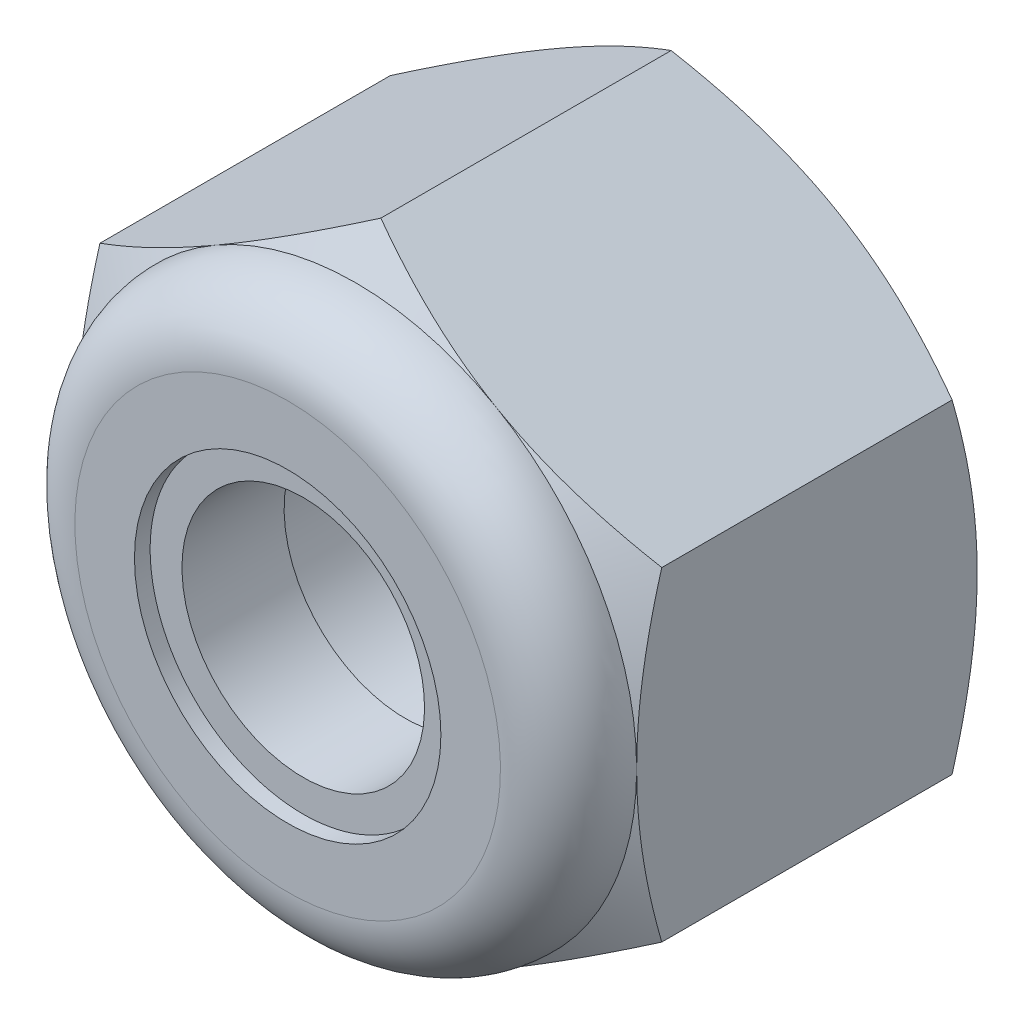
ISO-10303-21;
HEADER;
FILE_DESCRIPTION(('STEP AP214'),'2;1');
FILE_NAME('part.step','',(''),(''),'','','');
FILE_SCHEMA(('AUTOMOTIVE_DESIGN { 1 0 10303 214 1 1 1 1 }'));
ENDSEC;
DATA;
#1=APPLICATION_CONTEXT('core data for automotive mechanical design processes');
#2=APPLICATION_PROTOCOL_DEFINITION('international standard','automotive_design',2000,#1);
#3=PRODUCT_CONTEXT('',#1,'mechanical');
#4=PRODUCT('Part','Part','',(#3));
#5=PRODUCT_RELATED_PRODUCT_CATEGORY('part','',(#4));
#6=PRODUCT_DEFINITION_FORMATION('','',#4);
#7=PRODUCT_DEFINITION_CONTEXT('part definition',#1,'design');
#8=PRODUCT_DEFINITION('design','',#6,#7);
#9=PRODUCT_DEFINITION_SHAPE('','',#8);
#10=(LENGTH_UNIT() NAMED_UNIT(*) SI_UNIT(.MILLI.,.METRE.));
#11=(NAMED_UNIT(*) PLANE_ANGLE_UNIT() SI_UNIT($,.RADIAN.));
#12=(NAMED_UNIT(*) SI_UNIT($,.STERADIAN.) SOLID_ANGLE_UNIT());
#13=UNCERTAINTY_MEASURE_WITH_UNIT(LENGTH_MEASURE(1.E-05),#10,'distance_accuracy_value','');
#14=(GEOMETRIC_REPRESENTATION_CONTEXT(3) GLOBAL_UNCERTAINTY_ASSIGNED_CONTEXT((#13)) GLOBAL_UNIT_ASSIGNED_CONTEXT((#10,
#11,#12)) REPRESENTATION_CONTEXT('',''));
#15=CARTESIAN_POINT('',(0.,0.,0.));
#16=DIRECTION('',(0.,0.,1.));
#17=DIRECTION('',(1.,0.,0.));
#18=AXIS2_PLACEMENT_3D('',#15,#16,#17);
#19=CARTESIAN_POINT('',(0.,0.,3.8476));
#20=DIRECTION('',(0.,0.,1.));
#21=DIRECTION('',(0.,-1.,0.));
#22=AXIS2_PLACEMENT_3D('',#19,#20,#21);
#23=PLANE('',#22);
#24=CARTESIAN_POINT('',(0.,0.,3.8476));
#25=DIRECTION('',(0.,0.,1.));
#26=DIRECTION('',(0.,-1.,0.));
#27=AXIS2_PLACEMENT_3D('',#24,#25,#26);
#28=CIRCLE('',#27,1.1875);
#29=CARTESIAN_POINT('',(0.,1.1875,3.8476));
#30=VERTEX_POINT('',#29);
#31=EDGE_CURVE('P0_E49',#30,#30,#28,.T.);
#32=ORIENTED_EDGE('',*,*,#31,.F.);
#33=EDGE_LOOP('',(#32));
#34=FACE_BOUND('',#33,.T.);
#35=CARTESIAN_POINT('',(0.,0.,3.8476));
#36=DIRECTION('',(0.,0.,1.));
#37=DIRECTION('',(0.,-1.,0.));
#38=AXIS2_PLACEMENT_3D('',#35,#36,#37);
#39=CIRCLE('',#38,1.5);
#40=CARTESIAN_POINT('',(0.,1.5,3.8476));
#41=VERTEX_POINT('',#40);
#42=EDGE_CURVE('P0_E68',#41,#41,#39,.T.);
#43=ORIENTED_EDGE('',*,*,#42,.T.);
#44=EDGE_LOOP('',(#43));
#45=FACE_BOUND('',#44,.T.);
#46=ADVANCED_FACE('P0_F17',(#34,#45),#23,.T.);
#47=CARTESIAN_POINT('',(0.,0.,2.8476));
#48=DIRECTION('',(0.,0.,1.));
#49=DIRECTION('',(0.,-1.,0.));
#50=AXIS2_PLACEMENT_3D('',#47,#48,#49);
#51=PLANE('',#50);
#52=CARTESIAN_POINT('',(0.,0.,2.8476));
#53=DIRECTION('',(0.,0.,1.));
#54=DIRECTION('',(0.,-1.,0.));
#55=AXIS2_PLACEMENT_3D('',#52,#53,#54);
#56=CIRCLE('',#55,1.1875);
#57=CARTESIAN_POINT('',(0.,1.1875,2.8476));
#58=VERTEX_POINT('',#57);
#59=EDGE_CURVE('P0_E56',#58,#58,#56,.T.);
#60=ORIENTED_EDGE('',*,*,#59,.T.);
#61=EDGE_LOOP('',(#60));
#62=FACE_BOUND('',#61,.T.);
#63=CARTESIAN_POINT('',(0.,0.,2.8476));
#64=DIRECTION('',(0.,0.,1.));
#65=DIRECTION('',(0.,-1.,0.));
#66=AXIS2_PLACEMENT_3D('',#63,#64,#65);
#67=CIRCLE('',#66,1.5);
#68=CARTESIAN_POINT('',(0.,1.5,2.8476));
#69=VERTEX_POINT('',#68);
#70=EDGE_CURVE('P0_E11',#69,#69,#67,.T.);
#71=ORIENTED_EDGE('',*,*,#70,.F.);
#72=EDGE_LOOP('',(#71));
#73=FACE_BOUND('',#72,.T.);
#74=ADVANCED_FACE('P0_F60',(#62,#73),#51,.F.);
#75=CARTESIAN_POINT('',(0.,0.,2.8476));
#76=DIRECTION('',(0.,0.,1.));
#77=DIRECTION('',(0.,-1.,0.));
#78=AXIS2_PLACEMENT_3D('',#75,#76,#77);
#79=CYLINDRICAL_SURFACE('',#78,1.5);
#80=ORIENTED_EDGE('',*,*,#42,.F.);
#81=DIRECTION('',(0.,0.,-1.));
#82=VECTOR('',#81,1.);
#83=CARTESIAN_POINT('',(0.,1.5,2.8476));
#84=LINE('',#83,#82);
#85=EDGE_CURVE('P0_E21',#41,#69,#84,.T.);
#86=ORIENTED_EDGE('',*,*,#85,.T.);
#87=ORIENTED_EDGE('',*,*,#70,.T.);
#88=ORIENTED_EDGE('',*,*,#85,.F.);
#89=EDGE_LOOP('',(#80,#86,#87,#88));
#90=FACE_BOUND('',#89,.T.);
#91=ADVANCED_FACE('P0_F19',(#90),#79,.T.);
#92=CARTESIAN_POINT('',(0.,0.,2.8476));
#93=DIRECTION('',(0.,0.,1.));
#94=DIRECTION('',(0.,-1.,0.));
#95=AXIS2_PLACEMENT_3D('',#92,#93,#94);
#96=CYLINDRICAL_SURFACE('',#95,1.1875);
#97=ORIENTED_EDGE('',*,*,#59,.F.);
#98=DIRECTION('',(0.,0.,1.));
#99=VECTOR('',#98,1.);
#100=CARTESIAN_POINT('',(0.,1.1875,2.8476));
#101=LINE('',#100,#99);
#102=EDGE_CURVE('P0_E53',#58,#30,#101,.T.);
#103=ORIENTED_EDGE('',*,*,#102,.T.);
#104=ORIENTED_EDGE('',*,*,#31,.T.);
#105=ORIENTED_EDGE('',*,*,#102,.F.);
#106=EDGE_LOOP('',(#97,#103,#104,#105));
#107=FACE_BOUND('',#106,.T.);
#108=ADVANCED_FACE('P0_F55',(#107),#96,.F.);
#109=CLOSED_SHELL('',(#46,#74,#91,#108));
#110=MANIFOLD_SOLID_BREP('P0_B1',#109);
#111=CARTESIAN_POINT('',(0.,0.,0.));
#112=DIRECTION('',(0.,0.,1.));
#113=DIRECTION('',(0.,1.,0.));
#114=AXIS2_PLACEMENT_3D('',#111,#112,#113);
#115=CONICAL_SURFACE('',#114,2.75,1.0471975511966);
#116=CARTESIAN_POINT('',(1.375,2.38156986040721,0.));
#117=CARTESIAN_POINT('',(2.01313972079903,2.01313972082329,0.));
#118=CARTESIAN_POINT('',(2.74999999996174,1.58771324029356,0.245620093049108));
#119=(BOUNDED_CURVE() B_SPLINE_CURVE(2,(#116,#117,#118),.UNSPECIFIED.,.F.,
.F.) B_SPLINE_CURVE_WITH_KNOTS((3,3),(1.07884964363979,1.45937748055777),
.UNSPECIFIED.) CURVE() GEOMETRIC_REPRESENTATION_ITEM() RATIONAL_B_SPLINE_CURVE((2.36464609081185,
2.36464609081185,2.1948721399581)) REPRESENTATION_ITEM(''));
#120=CARTESIAN_POINT('',(1.375,2.38156986040721,0.));
#121=VERTEX_POINT('',#120);
#122=CARTESIAN_POINT('',(2.75,1.58771324027174,0.245620093061687));
#123=VERTEX_POINT('',#122);
#124=EDGE_CURVE('P1_E198',#121,#123,#119,.T.);
#125=ORIENTED_EDGE('',*,*,#124,.T.);
#126=CARTESIAN_POINT('',(2.75,1.58771324027167,0.245620093061918));
#127=CARTESIAN_POINT('',(2.75,0.736860279185669,0.));
#128=CARTESIAN_POINT('',(2.75,0.,0.));
#129=(BOUNDED_CURVE() B_SPLINE_CURVE(2,(#126,#127,#128),.UNSPECIFIED.,.F.,
.F.) B_SPLINE_CURVE_WITH_KNOTS((3,3),(0.698321806712598,1.07884964363979),
.UNSPECIFIED.) CURVE() GEOMETRIC_REPRESENTATION_ITEM() RATIONAL_B_SPLINE_CURVE((2.19487213994988,
2.36464609081185,2.36464609081185)) REPRESENTATION_ITEM(''));
#130=CARTESIAN_POINT('',(2.75,0.,0.));
#131=VERTEX_POINT('',#130);
#132=EDGE_CURVE('P1_E144',#123,#131,#129,.T.);
#133=ORIENTED_EDGE('',*,*,#132,.T.);
#134=CARTESIAN_POINT('',(0.,0.,0.));
#135=DIRECTION('',(0.,0.,-1.));
#136=DIRECTION('',(0.,1.,0.));
#137=AXIS2_PLACEMENT_3D('',#134,#135,#136);
#138=CIRCLE('',#137,2.75);
#139=EDGE_CURVE('P1_E206',#121,#131,#138,.T.);
#140=ORIENTED_EDGE('',*,*,#139,.F.);
#141=EDGE_LOOP('',(#125,#133,#140));
#142=FACE_BOUND('',#141,.T.);
#143=ADVANCED_FACE('P1_F17',(#142),#115,.T.);
#144=CARTESIAN_POINT('',(0.,0.,0.));
#145=DIRECTION('',(0.,0.,1.));
#146=DIRECTION('',(0.,1.,0.));
#147=AXIS2_PLACEMENT_3D('',#144,#145,#146);
#148=CONICAL_SURFACE('',#147,2.75,1.0471975511966);
#149=CARTESIAN_POINT('',(2.75,-1.58771324027147,0.24562009306186));
#150=CARTESIAN_POINT('',(2.01313972081441,-2.01313972081441,0.));
#151=CARTESIAN_POINT('',(1.375,-2.38156986040721,0.));
#152=(BOUNDED_CURVE() B_SPLINE_CURVE(2,(#149,#150,#151),.UNSPECIFIED.,.F.,
.F.) B_SPLINE_CURVE_WITH_KNOTS((3,3),(0.69832180671264,1.07884964363979),
.UNSPECIFIED.) CURVE() GEOMETRIC_REPRESENTATION_ITEM() RATIONAL_B_SPLINE_CURVE((2.19487213994992,
2.36464609081185,2.36464609081185)) REPRESENTATION_ITEM(''));
#153=CARTESIAN_POINT('',(2.75,-1.58771324027147,0.245620093061859));
#154=VERTEX_POINT('',#153);
#155=CARTESIAN_POINT('',(1.375,-2.38156986040721,0.));
#156=VERTEX_POINT('',#155);
#157=EDGE_CURVE('P1_E306',#154,#156,#152,.T.);
#158=ORIENTED_EDGE('',*,*,#157,.T.);
#159=CARTESIAN_POINT('',(0.,0.,0.));
#160=DIRECTION('',(0.,0.,-1.));
#161=DIRECTION('',(0.,1.,0.));
#162=AXIS2_PLACEMENT_3D('',#159,#160,#161);
#163=CIRCLE('',#162,2.75);
#164=EDGE_CURVE('P1_E213',#131,#156,#163,.T.);
#165=ORIENTED_EDGE('',*,*,#164,.F.);
#166=CARTESIAN_POINT('',(2.75,0.,0.));
#167=CARTESIAN_POINT('',(2.75,-0.736860279167901,0.));
#168=CARTESIAN_POINT('',(2.75,-1.58771324022746,0.245620093049155));
#169=(BOUNDED_CURVE() B_SPLINE_CURVE(2,(#166,#167,#168),.UNSPECIFIED.,.F.,
.F.) B_SPLINE_CURVE_WITH_KNOTS((3,3),(1.07884964363979,1.45937748055781),
.UNSPECIFIED.) CURVE() GEOMETRIC_REPRESENTATION_ITEM() RATIONAL_B_SPLINE_CURVE((2.36464609081185,
2.36464609081185,2.19487213995807)) REPRESENTATION_ITEM(''));
#170=EDGE_CURVE('P1_E11',#131,#154,#169,.T.);
#171=ORIENTED_EDGE('',*,*,#170,.T.);
#172=EDGE_LOOP('',(#158,#165,#171));
#173=FACE_BOUND('',#172,.T.);
#174=ADVANCED_FACE('P1_F695',(#173),#148,.T.);
#175=CARTESIAN_POINT('',(0.,0.,0.));
#176=DIRECTION('',(0.,0.,1.));
#177=DIRECTION('',(0.,-1.,0.));
#178=AXIS2_PLACEMENT_3D('',#175,#176,#177);
#179=CONICAL_SURFACE('',#178,2.75,1.0471975511966);
#180=CARTESIAN_POINT('',(0.,-3.17542648054294,0.24562009306186));
#181=CARTESIAN_POINT('',(-0.736860279185588,-2.75,0.));
#182=CARTESIAN_POINT('',(-1.375,-2.3815698604072,0.));
#183=(BOUNDED_CURVE() B_SPLINE_CURVE(2,(#180,#181,#182),.UNSPECIFIED.,.F.,
.F.) B_SPLINE_CURVE_WITH_KNOTS((3,3),(0.698321806712639,1.07884964363979),
.UNSPECIFIED.) CURVE() GEOMETRIC_REPRESENTATION_ITEM() RATIONAL_B_SPLINE_CURVE((2.19487213994992,
2.36464609081185,2.36464609081185)) REPRESENTATION_ITEM(''));
#184=CARTESIAN_POINT('',(0.,-3.17542648054294,0.245620093061859));
#185=VERTEX_POINT('',#184);
#186=CARTESIAN_POINT('',(-1.375,-2.38156986040721,0.));
#187=VERTEX_POINT('',#186);
#188=EDGE_CURVE('P1_E135',#185,#187,#183,.T.);
#189=ORIENTED_EDGE('',*,*,#188,.T.);
#190=CARTESIAN_POINT('',(0.,0.,0.));
#191=DIRECTION('',(0.,0.,-1.));
#192=DIRECTION('',(0.,1.,0.));
#193=AXIS2_PLACEMENT_3D('',#190,#191,#192);
#194=CIRCLE('',#193,2.75);
#195=EDGE_CURVE('P1_E138',#156,#187,#194,.T.);
#196=ORIENTED_EDGE('',*,*,#195,.F.);
#197=CARTESIAN_POINT('',(1.375,-2.38156986040721,0.));
#198=CARTESIAN_POINT('',(0.736860279200904,-2.74999999999116,0.));
#199=CARTESIAN_POINT('',(3.81079064727698E-11,-3.17542648052094,0.245620093049158));
#200=(BOUNDED_CURVE() B_SPLINE_CURVE(2,(#197,#198,#199),.UNSPECIFIED.,.F.,
.F.) B_SPLINE_CURVE_WITH_KNOTS((3,3),(1.07884964363979,1.45937748055781),
.UNSPECIFIED.) CURVE() GEOMETRIC_REPRESENTATION_ITEM() RATIONAL_B_SPLINE_CURVE((2.36464609081185,
2.36464609081185,2.19487213995807)) REPRESENTATION_ITEM(''));
#201=EDGE_CURVE('P1_E130',#156,#185,#200,.T.);
#202=ORIENTED_EDGE('',*,*,#201,.T.);
#203=EDGE_LOOP('',(#189,#196,#202));
#204=FACE_BOUND('',#203,.T.);
#205=ADVANCED_FACE('P1_F132',(#204),#179,.T.);
#206=CARTESIAN_POINT('',(0.,0.,0.));
#207=DIRECTION('',(0.,0.,1.));
#208=DIRECTION('',(0.,1.,0.));
#209=AXIS2_PLACEMENT_3D('',#206,#207,#208);
#210=CONICAL_SURFACE('',#209,2.75,1.0471975511966);
#211=CARTESIAN_POINT('',(-2.75,-1.58771324027147,0.24562009306186));
#212=CARTESIAN_POINT('',(-2.75,-0.736860279185586,0.));
#213=CARTESIAN_POINT('',(-2.75,0.,0.));
#214=(BOUNDED_CURVE() B_SPLINE_CURVE(2,(#211,#212,#213),.UNSPECIFIED.,.F.,
.F.) B_SPLINE_CURVE_WITH_KNOTS((3,3),(0.69832180671264,1.07884964363979),
.UNSPECIFIED.) CURVE() GEOMETRIC_REPRESENTATION_ITEM() RATIONAL_B_SPLINE_CURVE((2.19487213994992,
2.36464609081185,2.36464609081185)) REPRESENTATION_ITEM(''));
#215=CARTESIAN_POINT('',(-2.75,-1.58771324027147,0.24562009306186));
#216=VERTEX_POINT('',#215);
#217=CARTESIAN_POINT('',(-2.75,0.,0.));
#218=VERTEX_POINT('',#217);
#219=EDGE_CURVE('P1_E187',#216,#218,#214,.T.);
#220=ORIENTED_EDGE('',*,*,#219,.T.);
#221=CARTESIAN_POINT('',(0.,0.,0.));
#222=DIRECTION('',(0.,0.,-1.));
#223=DIRECTION('',(0.,1.,0.));
#224=AXIS2_PLACEMENT_3D('',#221,#222,#223);
#225=CIRCLE('',#224,2.75);
#226=EDGE_CURVE('P1_E222',#187,#218,#225,.T.);
#227=ORIENTED_EDGE('',*,*,#226,.F.);
#228=CARTESIAN_POINT('',(-1.375,-2.38156986040721,0.));
#229=CARTESIAN_POINT('',(-2.0131397207991,-2.01313972082326,0.));
#230=CARTESIAN_POINT('',(-2.74999999996189,-1.58771324029347,0.245620093049157));
#231=(BOUNDED_CURVE() B_SPLINE_CURVE(2,(#228,#229,#230),.UNSPECIFIED.,.F.,
.F.) B_SPLINE_CURVE_WITH_KNOTS((3,3),(1.07884964363979,1.45937748055781),
.UNSPECIFIED.) CURVE() GEOMETRIC_REPRESENTATION_ITEM() RATIONAL_B_SPLINE_CURVE((2.36464609081185,
2.36464609081185,2.19487213995807)) REPRESENTATION_ITEM(''));
#232=EDGE_CURVE('P1_E163',#187,#216,#231,.T.);
#233=ORIENTED_EDGE('',*,*,#232,.T.);
#234=EDGE_LOOP('',(#220,#227,#233));
#235=FACE_BOUND('',#234,.T.);
#236=ADVANCED_FACE('P1_F704',(#235),#210,.T.);
#237=CARTESIAN_POINT('',(0.,0.,0.));
#238=DIRECTION('',(0.,0.,1.));
#239=DIRECTION('',(0.,1.,0.));
#240=AXIS2_PLACEMENT_3D('',#237,#238,#239);
#241=CONICAL_SURFACE('',#240,2.75,1.0471975511966);
#242=CARTESIAN_POINT('',(-2.75,0.,0.));
#243=CARTESIAN_POINT('',(-2.75,0.736860279167905,0.));
#244=CARTESIAN_POINT('',(-2.75,1.58771324022747,0.245620093049161));
#245=(BOUNDED_CURVE() B_SPLINE_CURVE(2,(#242,#243,#244),.UNSPECIFIED.,.F.,
.F.) B_SPLINE_CURVE_WITH_KNOTS((3,3),(1.07884964363979,1.45937748055781),
.UNSPECIFIED.) CURVE() GEOMETRIC_REPRESENTATION_ITEM() RATIONAL_B_SPLINE_CURVE((2.36464609081185,
2.36464609081185,2.19487213995806)) REPRESENTATION_ITEM(''));
#246=CARTESIAN_POINT('',(-2.75,1.58771324027147,0.245620093061863));
#247=VERTEX_POINT('',#246);
#248=EDGE_CURVE('P1_E165',#218,#247,#245,.T.);
#249=ORIENTED_EDGE('',*,*,#248,.T.);
#250=CARTESIAN_POINT('',(-2.75,1.58771324027147,0.245620093061863));
#251=CARTESIAN_POINT('',(-2.01313972081441,2.01313972081441,0.));
#252=CARTESIAN_POINT('',(-1.375,2.38156986040721,0.));
#253=(BOUNDED_CURVE() B_SPLINE_CURVE(2,(#250,#251,#252),.UNSPECIFIED.,.F.,
.F.) B_SPLINE_CURVE_WITH_KNOTS((3,3),(0.69832180671264,1.07884964363979),
.UNSPECIFIED.) CURVE() GEOMETRIC_REPRESENTATION_ITEM() RATIONAL_B_SPLINE_CURVE((2.19487213994991,
2.36464609081185,2.36464609081185)) REPRESENTATION_ITEM(''));
#254=CARTESIAN_POINT('',(-1.375,2.38156986040721,0.));
#255=VERTEX_POINT('',#254);
#256=EDGE_CURVE('P1_E204',#247,#255,#253,.T.);
#257=ORIENTED_EDGE('',*,*,#256,.T.);
#258=CARTESIAN_POINT('',(0.,0.,0.));
#259=DIRECTION('',(0.,0.,-1.));
#260=DIRECTION('',(0.,1.,0.));
#261=AXIS2_PLACEMENT_3D('',#258,#259,#260);
#262=CIRCLE('',#261,2.75);
#263=EDGE_CURVE('P1_E476',#218,#255,#262,.T.);
#264=ORIENTED_EDGE('',*,*,#263,.F.);
#265=EDGE_LOOP('',(#249,#257,#264));
#266=FACE_BOUND('',#265,.T.);
#267=ADVANCED_FACE('P1_F674',(#266),#241,.T.);
#268=CARTESIAN_POINT('',(0.,0.,3.33333333333333));
#269=DIRECTION('',(0.,0.,-1.));
#270=DIRECTION('',(0.,-1.,0.));
#271=AXIS2_PLACEMENT_3D('',#268,#269,#270);
#272=CONICAL_SURFACE('',#271,2.75,1.0471975511966);
#273=CARTESIAN_POINT('',(-1.375,2.38156986040721,3.33333333333333));
#274=CARTESIAN_POINT('',(-2.01313972079904,2.01313972082329,3.33333333333333));
#275=CARTESIAN_POINT('',(-2.74999999996175,1.58771324029356,3.08771324028422));
#276=(BOUNDED_CURVE() B_SPLINE_CURVE(2,(#273,#274,#275),.UNSPECIFIED.,.F.,
.F.) B_SPLINE_CURVE_WITH_KNOTS((3,3),(1.07884964363979,1.45937748055777),
.UNSPECIFIED.) CURVE() GEOMETRIC_REPRESENTATION_ITEM() RATIONAL_B_SPLINE_CURVE((2.36464609081185,
2.36464609081185,2.19487213995809)) REPRESENTATION_ITEM(''));
#277=CARTESIAN_POINT('',(-1.375,2.38156986040721,3.33333333333333));
#278=VERTEX_POINT('',#277);
#279=CARTESIAN_POINT('',(-2.75,1.58771324027174,3.08771324027165));
#280=VERTEX_POINT('',#279);
#281=EDGE_CURVE('P1_E188',#278,#280,#276,.T.);
#282=ORIENTED_EDGE('',*,*,#281,.T.);
#283=CARTESIAN_POINT('',(-2.75,1.58771324027167,3.08771324027142));
#284=CARTESIAN_POINT('',(-2.75,0.736860279185665,3.33333333333333));
#285=CARTESIAN_POINT('',(-2.75,0.,3.33333333333333));
#286=(BOUNDED_CURVE() B_SPLINE_CURVE(2,(#283,#284,#285),.UNSPECIFIED.,.F.,
.F.) B_SPLINE_CURVE_WITH_KNOTS((3,3),(0.698321806712598,1.07884964363979),
.UNSPECIFIED.) CURVE() GEOMETRIC_REPRESENTATION_ITEM() RATIONAL_B_SPLINE_CURVE((2.19487213994988,
2.36464609081185,2.36464609081185)) REPRESENTATION_ITEM(''));
#287=CARTESIAN_POINT('',(-2.75,0.,3.33333333333333));
#288=VERTEX_POINT('',#287);
#289=EDGE_CURVE('P1_E172',#280,#288,#286,.T.);
#290=ORIENTED_EDGE('',*,*,#289,.T.);
#291=CARTESIAN_POINT('',(0.,0.,3.33333333333333));
#292=DIRECTION('',(0.,0.,1.));
#293=DIRECTION('',(0.,-1.,0.));
#294=AXIS2_PLACEMENT_3D('',#291,#292,#293);
#295=CIRCLE('',#294,2.75);
#296=EDGE_CURVE('P1_E239',#278,#288,#295,.T.);
#297=ORIENTED_EDGE('',*,*,#296,.F.);
#298=EDGE_LOOP('',(#282,#290,#297));
#299=FACE_BOUND('',#298,.T.);
#300=ADVANCED_FACE('P1_F19',(#299),#272,.T.);
#301=CARTESIAN_POINT('',(0.,0.,3.33333333333333));
#302=DIRECTION('',(0.,0.,-1.));
#303=DIRECTION('',(0.,-1.,0.));
#304=AXIS2_PLACEMENT_3D('',#301,#302,#303);
#305=CONICAL_SURFACE('',#304,2.75,1.0471975511966);
#306=CARTESIAN_POINT('',(-2.75,0.,3.33333333333333));
#307=CARTESIAN_POINT('',(-2.75,-0.736860279167899,3.33333333333333));
#308=CARTESIAN_POINT('',(-2.75,-1.58771324022745,3.08771324028418));
#309=(BOUNDED_CURVE() B_SPLINE_CURVE(2,(#306,#307,#308),.UNSPECIFIED.,.F.,
.F.) B_SPLINE_CURVE_WITH_KNOTS((3,3),(1.07884964363979,1.4593774805578),
.UNSPECIFIED.) CURVE() GEOMETRIC_REPRESENTATION_ITEM() RATIONAL_B_SPLINE_CURVE((2.36464609081185,
2.36464609081185,2.19487213995807)) REPRESENTATION_ITEM(''));
#310=CARTESIAN_POINT('',(-2.75,-1.58771324027147,3.08771324027147));
#311=VERTEX_POINT('',#310);
#312=EDGE_CURVE('P1_E370',#288,#311,#309,.T.);
#313=ORIENTED_EDGE('',*,*,#312,.T.);
#314=CARTESIAN_POINT('',(-2.75,-1.58771324027147,3.08771324027148));
#315=CARTESIAN_POINT('',(-2.01313972081441,-2.01313972081441,3.33333333333334));
#316=CARTESIAN_POINT('',(-1.37499999999999,-2.38156986040721,3.33333333333334));
#317=(BOUNDED_CURVE() B_SPLINE_CURVE(2,(#314,#315,#316),.UNSPECIFIED.,.F.,
.F.) B_SPLINE_CURVE_WITH_KNOTS((3,3),(0.69832180671264,1.07884964363979),
.UNSPECIFIED.) CURVE() GEOMETRIC_REPRESENTATION_ITEM() RATIONAL_B_SPLINE_CURVE((2.19487213994992,
2.36464609081185,2.36464609081185)) REPRESENTATION_ITEM(''));
#318=CARTESIAN_POINT('',(-1.375,-2.38156986040721,3.33333333333333));
#319=VERTEX_POINT('',#318);
#320=EDGE_CURVE('P1_E157',#311,#319,#317,.T.);
#321=ORIENTED_EDGE('',*,*,#320,.T.);
#322=CARTESIAN_POINT('',(0.,0.,3.33333333333333));
#323=DIRECTION('',(0.,0.,1.));
#324=DIRECTION('',(0.,-1.,0.));
#325=AXIS2_PLACEMENT_3D('',#322,#323,#324);
#326=CIRCLE('',#325,2.75);
#327=EDGE_CURVE('P1_E349',#288,#319,#326,.T.);
#328=ORIENTED_EDGE('',*,*,#327,.F.);
#329=EDGE_LOOP('',(#313,#321,#328));
#330=FACE_BOUND('',#329,.T.);
#331=ADVANCED_FACE('P1_F680',(#330),#305,.T.);
#332=CARTESIAN_POINT('',(0.,0.,3.33333333333333));
#333=DIRECTION('',(0.,0.,-1.));
#334=DIRECTION('',(0.,-1.,0.));
#335=AXIS2_PLACEMENT_3D('',#332,#333,#334);
#336=CONICAL_SURFACE('',#335,2.75,1.0471975511966);
#337=CARTESIAN_POINT('',(1.375,-2.38156986040721,3.33333333333333));
#338=CARTESIAN_POINT('',(2.0131397207991,-2.01313972082326,3.33333333333333));
#339=CARTESIAN_POINT('',(2.74999999996189,-1.58771324029347,3.08771324028418));
#340=(BOUNDED_CURVE() B_SPLINE_CURVE(2,(#337,#338,#339),.UNSPECIFIED.,.F.,
.F.) B_SPLINE_CURVE_WITH_KNOTS((3,3),(1.07884964363979,1.45937748055781),
.UNSPECIFIED.) CURVE() GEOMETRIC_REPRESENTATION_ITEM() RATIONAL_B_SPLINE_CURVE((2.36464609081185,
2.36464609081185,2.19487213995806)) REPRESENTATION_ITEM(''));
#341=CARTESIAN_POINT('',(1.375,-2.38156986040721,3.33333333333333));
#342=VERTEX_POINT('',#341);
#343=CARTESIAN_POINT('',(2.75,-1.58771324027147,3.08771324027147));
#344=VERTEX_POINT('',#343);
#345=EDGE_CURVE('P1_E145',#342,#344,#340,.T.);
#346=ORIENTED_EDGE('',*,*,#345,.T.);
#347=CARTESIAN_POINT('',(2.75,-1.58771324027147,3.08771324027147));
#348=CARTESIAN_POINT('',(2.75,-0.736860279185586,3.33333333333334));
#349=CARTESIAN_POINT('',(2.75,0.,3.33333333333334));
#350=(BOUNDED_CURVE() B_SPLINE_CURVE(2,(#347,#348,#349),.UNSPECIFIED.,.F.,
.F.) B_SPLINE_CURVE_WITH_KNOTS((3,3),(0.69832180671264,1.07884964363979),
.UNSPECIFIED.) CURVE() GEOMETRIC_REPRESENTATION_ITEM() RATIONAL_B_SPLINE_CURVE((2.19487213994992,
2.36464609081185,2.36464609081185)) REPRESENTATION_ITEM(''));
#351=CARTESIAN_POINT('',(2.75,0.,3.33333333333333));
#352=VERTEX_POINT('',#351);
#353=EDGE_CURVE('P1_E29',#344,#352,#350,.T.);
#354=ORIENTED_EDGE('',*,*,#353,.T.);
#355=CARTESIAN_POINT('',(0.,0.,3.33333333333333));
#356=DIRECTION('',(0.,0.,1.));
#357=DIRECTION('',(0.,-1.,0.));
#358=AXIS2_PLACEMENT_3D('',#355,#356,#357);
#359=CIRCLE('',#358,2.75);
#360=EDGE_CURVE('P1_E343',#342,#352,#359,.T.);
#361=ORIENTED_EDGE('',*,*,#360,.F.);
#362=EDGE_LOOP('',(#346,#354,#361));
#363=FACE_BOUND('',#362,.T.);
#364=ADVANCED_FACE('P1_F706',(#363),#336,.T.);
#365=CARTESIAN_POINT('',(0.,0.,3.33333333333333));
#366=DIRECTION('',(0.,0.,-1.));
#367=DIRECTION('',(0.,-1.,0.));
#368=AXIS2_PLACEMENT_3D('',#365,#366,#367);
#369=CONICAL_SURFACE('',#368,2.75,1.0471975511966);
#370=CARTESIAN_POINT('',(2.74999999999985,1.58771324027156,3.08771324027152));
#371=CARTESIAN_POINT('',(2.01313972081435,2.01313972081445,3.33333333333333));
#372=CARTESIAN_POINT('',(1.375,2.38156986040721,3.33333333333333));
#373=(BOUNDED_CURVE() B_SPLINE_CURVE(2,(#370,#371,#372),.UNSPECIFIED.,.F.,
.F.) B_SPLINE_CURVE_WITH_KNOTS((3,3),(0.698321806712675,1.07884964363979),
.UNSPECIFIED.) CURVE() GEOMETRIC_REPRESENTATION_ITEM() RATIONAL_B_SPLINE_CURVE((2.19487213994994,
2.36464609081185,2.36464609081185)) REPRESENTATION_ITEM(''));
#374=CARTESIAN_POINT('',(2.75,1.58771324027174,3.08771324027165));
#375=VERTEX_POINT('',#374);
#376=CARTESIAN_POINT('',(1.375,2.38156986040721,3.33333333333333));
#377=VERTEX_POINT('',#376);
#378=EDGE_CURVE('P1_E108',#375,#377,#373,.T.);
#379=ORIENTED_EDGE('',*,*,#378,.T.);
#380=CARTESIAN_POINT('',(0.,0.,3.33333333333333));
#381=DIRECTION('',(0.,0.,1.));
#382=DIRECTION('',(0.,-1.,0.));
#383=AXIS2_PLACEMENT_3D('',#380,#381,#382);
#384=CIRCLE('',#383,2.75);
#385=EDGE_CURVE('P1_E348',#352,#377,#384,.T.);
#386=ORIENTED_EDGE('',*,*,#385,.F.);
#387=CARTESIAN_POINT('',(2.75,0.,3.33333333333334));
#388=CARTESIAN_POINT('',(2.75,0.736860279167983,3.33333333333333));
#389=CARTESIAN_POINT('',(2.75,1.58771324022767,3.08771324028412));
#390=(BOUNDED_CURVE() B_SPLINE_CURVE(2,(#387,#388,#389),.UNSPECIFIED.,.F.,
.F.) B_SPLINE_CURVE_WITH_KNOTS((3,3),(1.07884964363979,1.45937748055785),
.UNSPECIFIED.) CURVE() GEOMETRIC_REPRESENTATION_ITEM() RATIONAL_B_SPLINE_CURVE((2.36464609081185,
2.36464609081185,2.19487213995803)) REPRESENTATION_ITEM(''));
#391=EDGE_CURVE('P1_E256',#352,#375,#390,.T.);
#392=ORIENTED_EDGE('',*,*,#391,.T.);
#393=EDGE_LOOP('',(#379,#386,#392));
#394=FACE_BOUND('',#393,.T.);
#395=ADVANCED_FACE('P1_F608',(#394),#369,.T.);
#396=CARTESIAN_POINT('',(0.,0.,3.33333333333333));
#397=DIRECTION('',(0.,0.,-1.));
#398=DIRECTION('',(0.,1.,0.));
#399=AXIS2_PLACEMENT_3D('',#396,#397,#398);
#400=CONICAL_SURFACE('',#399,2.75,1.0471975511966);
#401=CARTESIAN_POINT('',(1.375,2.38156986040721,3.33333333333333));
#402=CARTESIAN_POINT('',(0.736860279200904,2.74999999999116,3.33333333333333));
#403=CARTESIAN_POINT('',(3.81093227850973E-11,3.17542648052094,3.08771324028418));
#404=(BOUNDED_CURVE() B_SPLINE_CURVE(2,(#401,#402,#403),.UNSPECIFIED.,.F.,
.F.) B_SPLINE_CURVE_WITH_KNOTS((3,3),(1.07884964363979,1.45937748055781),
.UNSPECIFIED.) CURVE() GEOMETRIC_REPRESENTATION_ITEM() RATIONAL_B_SPLINE_CURVE((2.36464609081185,
2.36464609081185,2.19487213995806)) REPRESENTATION_ITEM(''));
#405=CARTESIAN_POINT('',(0.,3.17542648054294,3.08771324027147));
#406=VERTEX_POINT('',#405);
#407=EDGE_CURVE('P1_E388',#377,#406,#404,.T.);
#408=ORIENTED_EDGE('',*,*,#407,.T.);
#409=CARTESIAN_POINT('',(0.,3.17542648054294,3.08771324027147));
#410=CARTESIAN_POINT('',(-0.736860279185586,2.75,3.33333333333333));
#411=CARTESIAN_POINT('',(-1.375,2.38156986040721,3.33333333333333));
#412=(BOUNDED_CURVE() B_SPLINE_CURVE(2,(#409,#410,#411),.UNSPECIFIED.,.F.,
.F.) B_SPLINE_CURVE_WITH_KNOTS((3,3),(0.69832180671264,1.07884964363979),
.UNSPECIFIED.) CURVE() GEOMETRIC_REPRESENTATION_ITEM() RATIONAL_B_SPLINE_CURVE((2.19487213994991,
2.36464609081185,2.36464609081185)) REPRESENTATION_ITEM(''));
#413=EDGE_CURVE('P1_E70',#406,#278,#412,.T.);
#414=ORIENTED_EDGE('',*,*,#413,.T.);
#415=CARTESIAN_POINT('',(0.,0.,3.33333333333333));
#416=DIRECTION('',(0.,0.,1.));
#417=DIRECTION('',(0.,-1.,0.));
#418=AXIS2_PLACEMENT_3D('',#415,#416,#417);
#419=CIRCLE('',#418,2.75);
#420=CARTESIAN_POINT('',(0.,2.75,3.33333333333334));
#421=VERTEX_POINT('',#420);
#422=EDGE_CURVE('P1_E235',#421,#278,#419,.T.);
#423=ORIENTED_EDGE('',*,*,#422,.F.);
#424=CARTESIAN_POINT('',(0.,0.,3.33333333333333));
#425=DIRECTION('',(0.,0.,1.));
#426=DIRECTION('',(0.,-1.,0.));
#427=AXIS2_PLACEMENT_3D('',#424,#425,#426);
#428=CIRCLE('',#427,2.75);
#429=EDGE_CURVE('P1_E87',#377,#421,#428,.T.);
#430=ORIENTED_EDGE('',*,*,#429,.F.);
#431=EDGE_LOOP('',(#408,#414,#423,#430));
#432=FACE_BOUND('',#431,.T.);
#433=ADVANCED_FACE('P1_F605',(#432),#400,.T.);
#434=CARTESIAN_POINT('',(2.75,-1.58771324027147,4.));
#435=DIRECTION('',(-1.,0.,0.));
#436=DIRECTION('',(0.,0.,1.));
#437=AXIS2_PLACEMENT_3D('',#434,#435,#436);
#438=PLANE('',#437);
#439=ORIENTED_EDGE('',*,*,#132,.F.);
#440=DIRECTION('',(0.,0.,-1.));
#441=VECTOR('',#440,1.);
#442=CARTESIAN_POINT('',(2.75,1.58771324027147,4.));
#443=LINE('',#442,#441);
#444=EDGE_CURVE('P1_E205',#375,#123,#443,.T.);
#445=ORIENTED_EDGE('',*,*,#444,.F.);
#446=ORIENTED_EDGE('',*,*,#391,.F.);
#447=ORIENTED_EDGE('',*,*,#353,.F.);
#448=DIRECTION('',(0.,0.,-1.));
#449=VECTOR('',#448,1.);
#450=CARTESIAN_POINT('',(2.75,-1.58771324027147,4.));
#451=LINE('',#450,#449);
#452=EDGE_CURVE('P1_E298',#344,#154,#451,.T.);
#453=ORIENTED_EDGE('',*,*,#452,.T.);
#454=ORIENTED_EDGE('',*,*,#170,.F.);
#455=EDGE_LOOP('',(#439,#445,#446,#447,#453,#454));
#456=FACE_BOUND('',#455,.T.);
#457=ADVANCED_FACE('P1_F611',(#456),#438,.F.);
#458=CARTESIAN_POINT('',(0.,-3.17542648054294,4.));
#459=DIRECTION('',(-0.5,0.866025403784439,0.));
#460=DIRECTION('',(0.,0.,1.));
#461=AXIS2_PLACEMENT_3D('',#458,#459,#460);
#462=PLANE('',#461);
#463=ORIENTED_EDGE('',*,*,#157,.F.);
#464=ORIENTED_EDGE('',*,*,#452,.F.);
#465=ORIENTED_EDGE('',*,*,#345,.F.);
#466=CARTESIAN_POINT('',(3.81089181244323E-11,-3.17542648052094,3.08771324028418));
#467=CARTESIAN_POINT('',(0.736860279200904,-2.74999999999116,3.33333333333333));
#468=CARTESIAN_POINT('',(1.375,-2.38156986040721,3.33333333333333));
#469=(BOUNDED_CURVE() B_SPLINE_CURVE(2,(#466,#467,#468),.UNSPECIFIED.,.F.,
.F.) B_SPLINE_CURVE_WITH_KNOTS((3,3),(-1.45937748055781,-1.07884964363979),
.UNSPECIFIED.) CURVE() GEOMETRIC_REPRESENTATION_ITEM() RATIONAL_B_SPLINE_CURVE((2.19487213995806,
2.36464609081185,2.36464609081185)) REPRESENTATION_ITEM(''));
#470=CARTESIAN_POINT('',(0.,-3.17542648054294,3.08771324027147));
#471=VERTEX_POINT('',#470);
#472=EDGE_CURVE('P1_E152',#471,#342,#469,.T.);
#473=ORIENTED_EDGE('',*,*,#472,.F.);
#474=DIRECTION('',(0.,0.,-1.));
#475=VECTOR('',#474,1.);
#476=CARTESIAN_POINT('',(0.,-3.17542648054294,4.));
#477=LINE('',#476,#475);
#478=EDGE_CURVE('P1_E148',#471,#185,#477,.T.);
#479=ORIENTED_EDGE('',*,*,#478,.T.);
#480=ORIENTED_EDGE('',*,*,#201,.F.);
#481=EDGE_LOOP('',(#463,#464,#465,#473,#479,#480));
#482=FACE_BOUND('',#481,.T.);
#483=ADVANCED_FACE('P1_F149',(#482),#462,.F.);
#484=CARTESIAN_POINT('',(-2.75,-1.58771324027147,4.));
#485=DIRECTION('',(0.5,0.866025403784439,0.));
#486=DIRECTION('',(0.,0.,-1.));
#487=AXIS2_PLACEMENT_3D('',#484,#485,#486);
#488=PLANE('',#487);
#489=ORIENTED_EDGE('',*,*,#188,.F.);
#490=ORIENTED_EDGE('',*,*,#478,.F.);
#491=CARTESIAN_POINT('',(-1.37499999999999,-2.38156986040721,3.33333333333334));
#492=CARTESIAN_POINT('',(-0.736860279200899,-2.74999999999116,3.33333333333333));
#493=CARTESIAN_POINT('',(-3.810305054479E-11,-3.17542648052094,3.08771324028417));
#494=(BOUNDED_CURVE() B_SPLINE_CURVE(2,(#491,#492,#493),.UNSPECIFIED.,.F.,
.F.) B_SPLINE_CURVE_WITH_KNOTS((3,3),(1.07884964363979,1.45937748055781),
.UNSPECIFIED.) CURVE() GEOMETRIC_REPRESENTATION_ITEM() RATIONAL_B_SPLINE_CURVE((2.36464609081185,
2.36464609081185,2.19487213995807)) REPRESENTATION_ITEM(''));
#495=EDGE_CURVE('P1_E247',#319,#471,#494,.T.);
#496=ORIENTED_EDGE('',*,*,#495,.F.);
#497=ORIENTED_EDGE('',*,*,#320,.F.);
#498=DIRECTION('',(0.,0.,-1.));
#499=VECTOR('',#498,1.);
#500=CARTESIAN_POINT('',(-2.75,-1.58771324027147,4.));
#501=LINE('',#500,#499);
#502=EDGE_CURVE('P1_E463',#311,#216,#501,.T.);
#503=ORIENTED_EDGE('',*,*,#502,.T.);
#504=ORIENTED_EDGE('',*,*,#232,.F.);
#505=EDGE_LOOP('',(#489,#490,#496,#497,#503,#504));
#506=FACE_BOUND('',#505,.T.);
#507=ADVANCED_FACE('P1_F160',(#506),#488,.F.);
#508=CARTESIAN_POINT('',(-2.75,1.58771324027147,4.));
#509=DIRECTION('',(1.,0.,0.));
#510=DIRECTION('',(0.,1.,0.));
#511=AXIS2_PLACEMENT_3D('',#508,#509,#510);
#512=PLANE('',#511);
#513=ORIENTED_EDGE('',*,*,#219,.F.);
#514=ORIENTED_EDGE('',*,*,#502,.F.);
#515=ORIENTED_EDGE('',*,*,#312,.F.);
#516=ORIENTED_EDGE('',*,*,#289,.F.);
#517=DIRECTION('',(0.,0.,-1.));
#518=VECTOR('',#517,1.);
#519=CARTESIAN_POINT('',(-2.75,1.58771324027147,4.));
#520=LINE('',#519,#518);
#521=EDGE_CURVE('P1_E228',#280,#247,#520,.T.);
#522=ORIENTED_EDGE('',*,*,#521,.T.);
#523=ORIENTED_EDGE('',*,*,#248,.F.);
#524=EDGE_LOOP('',(#513,#514,#515,#516,#522,#523));
#525=FACE_BOUND('',#524,.T.);
#526=ADVANCED_FACE('P1_F678',(#525),#512,.F.);
#527=CARTESIAN_POINT('',(0.,3.17542648054294,4.));
#528=DIRECTION('',(0.5,-0.866025403784439,0.));
#529=DIRECTION('',(0.,0.,-1.));
#530=AXIS2_PLACEMENT_3D('',#527,#528,#529);
#531=PLANE('',#530);
#532=ORIENTED_EDGE('',*,*,#256,.F.);
#533=ORIENTED_EDGE('',*,*,#521,.F.);
#534=ORIENTED_EDGE('',*,*,#281,.F.);
#535=ORIENTED_EDGE('',*,*,#413,.F.);
#536=DIRECTION('',(0.,0.,-1.));
#537=VECTOR('',#536,1.);
#538=CARTESIAN_POINT('',(0.,3.17542648054294,4.));
#539=LINE('',#538,#537);
#540=CARTESIAN_POINT('',(0.,3.17542648054294,0.245620093061863));
#541=VERTEX_POINT('',#540);
#542=EDGE_CURVE('P1_E486',#406,#541,#539,.T.);
#543=ORIENTED_EDGE('',*,*,#542,.T.);
#544=CARTESIAN_POINT('',(-1.375,2.38156986040721,0.));
#545=CARTESIAN_POINT('',(-0.736860279200899,2.74999999999116,0.));
#546=CARTESIAN_POINT('',(-3.81014571934218E-11,3.17542648052094,0.245620093049161));
#547=(BOUNDED_CURVE() B_SPLINE_CURVE(2,(#544,#545,#546),.UNSPECIFIED.,.F.,
.F.) B_SPLINE_CURVE_WITH_KNOTS((3,3),(1.07884964363979,1.45937748055781),
.UNSPECIFIED.) CURVE() GEOMETRIC_REPRESENTATION_ITEM() RATIONAL_B_SPLINE_CURVE((2.36464609081185,
2.36464609081185,2.19487213995806)) REPRESENTATION_ITEM(''));
#548=EDGE_CURVE('P1_E471',#255,#541,#547,.T.);
#549=ORIENTED_EDGE('',*,*,#548,.F.);
#550=EDGE_LOOP('',(#532,#533,#534,#535,#543,#549));
#551=FACE_BOUND('',#550,.T.);
#552=ADVANCED_FACE('P1_F647',(#551),#531,.F.);
#553=CARTESIAN_POINT('',(2.75,1.58771324027147,4.));
#554=DIRECTION('',(-0.5,-0.866025403784439,0.));
#555=DIRECTION('',(-0.866025403784439,0.5,0.));
#556=AXIS2_PLACEMENT_3D('',#553,#554,#555);
#557=PLANE('',#556);
#558=CARTESIAN_POINT('',(3.8114988034407E-11,3.17542648052094,0.245620093049159));
#559=CARTESIAN_POINT('',(0.736860279200908,2.74999999999116,0.));
#560=CARTESIAN_POINT('',(1.375,2.38156986040721,0.));
#561=(BOUNDED_CURVE() B_SPLINE_CURVE(2,(#558,#559,#560),.UNSPECIFIED.,.F.,
.F.) B_SPLINE_CURVE_WITH_KNOTS((3,3),(-1.45937748055781,-1.07884964363979),
.UNSPECIFIED.) CURVE() GEOMETRIC_REPRESENTATION_ITEM() RATIONAL_B_SPLINE_CURVE((2.19487213995806,
2.36464609081185,2.36464609081185)) REPRESENTATION_ITEM(''));
#562=EDGE_CURVE('P1_E363',#541,#121,#561,.T.);
#563=ORIENTED_EDGE('',*,*,#562,.F.);
#564=ORIENTED_EDGE('',*,*,#542,.F.);
#565=ORIENTED_EDGE('',*,*,#407,.F.);
#566=ORIENTED_EDGE('',*,*,#378,.F.);
#567=ORIENTED_EDGE('',*,*,#444,.T.);
#568=ORIENTED_EDGE('',*,*,#124,.F.);
#569=EDGE_LOOP('',(#563,#564,#565,#566,#567,#568));
#570=FACE_BOUND('',#569,.T.);
#571=ADVANCED_FACE('P1_F615',(#570),#557,.F.);
#572=CARTESIAN_POINT('',(0.,0.,3.33333333333333));
#573=DIRECTION('',(0.,0.,1.));
#574=DIRECTION('',(0.,-1.,0.));
#575=AXIS2_PLACEMENT_3D('',#572,#573,#574);
#576=TOROIDAL_SURFACE('',#575,2.08333333333333,0.666666666666666);
#577=CARTESIAN_POINT('',(0.,0.,4.));
#578=DIRECTION('',(0.,0.,1.));
#579=DIRECTION('',(0.,-1.,0.));
#580=AXIS2_PLACEMENT_3D('',#577,#578,#579);
#581=CIRCLE('',#580,2.08333333333333);
#582=CARTESIAN_POINT('',(0.,2.08333333333333,4.));
#583=VERTEX_POINT('',#582);
#584=EDGE_CURVE('P1_E378',#583,#583,#581,.T.);
#585=ORIENTED_EDGE('',*,*,#584,.F.);
#586=CARTESIAN_POINT('',(0.,2.08333333333333,3.33333333333334));
#587=DIRECTION('',(-1.,0.,0.));
#588=DIRECTION('',(0.,1.,0.));
#589=AXIS2_PLACEMENT_3D('',#586,#587,#588);
#590=CIRCLE('',#589,0.666666666666666);
#591=EDGE_CURVE('P1_E178',#583,#421,#590,.T.);
#592=ORIENTED_EDGE('',*,*,#591,.T.);
#593=ORIENTED_EDGE('',*,*,#422,.T.);
#594=ORIENTED_EDGE('',*,*,#296,.T.);
#595=ORIENTED_EDGE('',*,*,#327,.T.);
#596=CARTESIAN_POINT('',(0.,0.,3.33333333333333));
#597=DIRECTION('',(0.,0.,1.));
#598=DIRECTION('',(0.,-1.,0.));
#599=AXIS2_PLACEMENT_3D('',#596,#597,#598);
#600=CIRCLE('',#599,2.75);
#601=EDGE_CURVE('P1_E358',#319,#342,#600,.T.);
#602=ORIENTED_EDGE('',*,*,#601,.T.);
#603=ORIENTED_EDGE('',*,*,#360,.T.);
#604=ORIENTED_EDGE('',*,*,#385,.T.);
#605=ORIENTED_EDGE('',*,*,#429,.T.);
#606=ORIENTED_EDGE('',*,*,#591,.F.);
#607=EDGE_LOOP('',(#585,#592,#593,#594,#595,#602,#603,#604,#605,#606));
#608=FACE_BOUND('',#607,.T.);
#609=ADVANCED_FACE('P1_F603',(#608),#576,.T.);
#610=CARTESIAN_POINT('',(0.,0.,3.33333333333333));
#611=DIRECTION('',(0.,0.,-1.));
#612=DIRECTION('',(0.,-1.,0.));
#613=AXIS2_PLACEMENT_3D('',#610,#611,#612);
#614=CONICAL_SURFACE('',#613,2.75,1.0471975511966);
#615=ORIENTED_EDGE('',*,*,#601,.F.);
#616=ORIENTED_EDGE('',*,*,#495,.T.);
#617=ORIENTED_EDGE('',*,*,#472,.T.);
#618=EDGE_LOOP('',(#615,#616,#617));
#619=FACE_BOUND('',#618,.T.);
#620=ADVANCED_FACE('P1_F683',(#619),#614,.T.);
#621=CARTESIAN_POINT('',(0.,0.,0.));
#622=DIRECTION('',(0.,0.,1.));
#623=DIRECTION('',(0.,1.,0.));
#624=AXIS2_PLACEMENT_3D('',#621,#622,#623);
#625=CONICAL_SURFACE('',#624,2.75,1.0471975511966);
#626=CARTESIAN_POINT('',(0.,0.,0.));
#627=DIRECTION('',(0.,0.,-1.));
#628=DIRECTION('',(0.,1.,0.));
#629=AXIS2_PLACEMENT_3D('',#626,#627,#628);
#630=CIRCLE('',#629,2.75);
#631=EDGE_CURVE('P1_E214',#255,#121,#630,.T.);
#632=ORIENTED_EDGE('',*,*,#631,.F.);
#633=ORIENTED_EDGE('',*,*,#548,.T.);
#634=ORIENTED_EDGE('',*,*,#562,.T.);
#635=EDGE_LOOP('',(#632,#633,#634));
#636=FACE_BOUND('',#635,.T.);
#637=ADVANCED_FACE('P1_F672',(#636),#625,.T.);
#638=CARTESIAN_POINT('',(5.5,0.,0.));
#639=DIRECTION('',(0.,0.,-1.));
#640=DIRECTION('',(-1.,0.,0.));
#641=AXIS2_PLACEMENT_3D('',#638,#639,#640);
#642=PLANE('',#641);
#643=CARTESIAN_POINT('',(0.,0.,0.));
#644=DIRECTION('',(0.,0.,1.));
#645=DIRECTION('',(1.,0.,0.));
#646=AXIS2_PLACEMENT_3D('',#643,#644,#645);
#647=CIRCLE('',#646,1.2645);
#648=CARTESIAN_POINT('',(-1.2645,0.,0.));
#649=VERTEX_POINT('',#648);
#650=EDGE_CURVE('P1_E196',#649,#649,#647,.T.);
#651=ORIENTED_EDGE('',*,*,#650,.T.);
#652=EDGE_LOOP('',(#651));
#653=FACE_BOUND('',#652,.T.);
#654=ORIENTED_EDGE('',*,*,#631,.T.);
#655=ORIENTED_EDGE('',*,*,#139,.T.);
#656=ORIENTED_EDGE('',*,*,#164,.T.);
#657=ORIENTED_EDGE('',*,*,#195,.T.);
#658=ORIENTED_EDGE('',*,*,#226,.T.);
#659=ORIENTED_EDGE('',*,*,#263,.T.);
#660=EDGE_LOOP('',(#654,#655,#656,#657,#658,#659));
#661=FACE_BOUND('',#660,.T.);
#662=ADVANCED_FACE('P1_F569',(#653,#661),#642,.T.);
#663=CARTESIAN_POINT('',(5.5,0.,4.));
#664=DIRECTION('',(0.,0.,-1.));
#665=DIRECTION('',(-1.,0.,0.));
#666=AXIS2_PLACEMENT_3D('',#663,#664,#665);
#667=PLANE('',#666);
#668=CARTESIAN_POINT('',(0.,0.,4.));
#669=DIRECTION('',(0.,0.,-1.));
#670=DIRECTION('',(-1.,0.,0.));
#671=AXIS2_PLACEMENT_3D('',#668,#669,#670);
#672=CIRCLE('',#671,1.5);
#673=CARTESIAN_POINT('',(1.5,0.,4.));
#674=VERTEX_POINT('',#673);
#675=EDGE_CURVE('P1_E215',#674,#674,#672,.T.);
#676=ORIENTED_EDGE('',*,*,#675,.T.);
#677=EDGE_LOOP('',(#676));
#678=FACE_BOUND('',#677,.T.);
#679=ORIENTED_EDGE('',*,*,#584,.T.);
#680=EDGE_LOOP('',(#679));
#681=FACE_BOUND('',#680,.T.);
#682=ADVANCED_FACE('P1_F595',(#678,#681),#667,.F.);
#683=CARTESIAN_POINT('',(0.,0.,0.));
#684=DIRECTION('',(0.,0.,1.));
#685=DIRECTION('',(1.,0.,0.));
#686=AXIS2_PLACEMENT_3D('',#683,#684,#685);
#687=CYLINDRICAL_SURFACE('',#686,1.2645);
#688=ORIENTED_EDGE('',*,*,#650,.F.);
#689=DIRECTION('',(0.,0.,1.));
#690=VECTOR('',#689,1.);
#691=CARTESIAN_POINT('',(-1.2645,0.,0.));
#692=LINE('',#691,#690);
#693=CARTESIAN_POINT('',(-1.2645,0.,2.8476));
#694=VERTEX_POINT('',#693);
#695=EDGE_CURVE('P1_E563',#649,#694,#692,.T.);
#696=ORIENTED_EDGE('',*,*,#695,.T.);
#697=CARTESIAN_POINT('',(0.,0.,2.8476));
#698=DIRECTION('',(0.,0.,1.));
#699=DIRECTION('',(1.,0.,0.));
#700=AXIS2_PLACEMENT_3D('',#697,#698,#699);
#701=CIRCLE('',#700,1.2645);
#702=EDGE_CURVE('P1_E189',#694,#694,#701,.T.);
#703=ORIENTED_EDGE('',*,*,#702,.T.);
#704=ORIENTED_EDGE('',*,*,#695,.F.);
#705=EDGE_LOOP('',(#688,#696,#703,#704));
#706=FACE_BOUND('',#705,.T.);
#707=ADVANCED_FACE('P1_F577',(#706),#687,.F.);
#708=CARTESIAN_POINT('',(0.,0.,2.8476));
#709=DIRECTION('',(0.,0.,-1.));
#710=DIRECTION('',(-1.,0.,0.));
#711=AXIS2_PLACEMENT_3D('',#708,#709,#710);
#712=PLANE('',#711);
#713=ORIENTED_EDGE('',*,*,#702,.F.);
#714=EDGE_LOOP('',(#713));
#715=FACE_BOUND('',#714,.T.);
#716=CARTESIAN_POINT('',(0.,0.,2.8476));
#717=DIRECTION('',(0.,0.,1.));
#718=DIRECTION('',(-1.,0.,0.));
#719=AXIS2_PLACEMENT_3D('',#716,#717,#718);
#720=CIRCLE('',#719,1.5);
#721=CARTESIAN_POINT('',(1.5,0.,2.8476));
#722=VERTEX_POINT('',#721);
#723=EDGE_CURVE('P1_E197',#722,#722,#720,.T.);
#724=ORIENTED_EDGE('',*,*,#723,.T.);
#725=EDGE_LOOP('',(#724));
#726=FACE_BOUND('',#725,.T.);
#727=ADVANCED_FACE('P1_F582',(#715,#726),#712,.F.);
#728=CARTESIAN_POINT('',(0.,0.,4.));
#729=DIRECTION('',(0.,0.,-1.));
#730=DIRECTION('',(-1.,0.,0.));
#731=AXIS2_PLACEMENT_3D('',#728,#729,#730);
#732=CYLINDRICAL_SURFACE('',#731,1.5);
#733=ORIENTED_EDGE('',*,*,#675,.F.);
#734=DIRECTION('',(0.,0.,-1.));
#735=VECTOR('',#734,1.);
#736=CARTESIAN_POINT('',(1.5,0.,4.));
#737=LINE('',#736,#735);
#738=EDGE_CURVE('P1_E219',#674,#722,#737,.T.);
#739=ORIENTED_EDGE('',*,*,#738,.T.);
#740=ORIENTED_EDGE('',*,*,#723,.F.);
#741=ORIENTED_EDGE('',*,*,#738,.F.);
#742=EDGE_LOOP('',(#733,#739,#740,#741));
#743=FACE_BOUND('',#742,.T.);
#744=ADVANCED_FACE('P1_F585',(#743),#732,.F.);
#745=CLOSED_SHELL('',(#143,#174,#205,#236,#267,#300,#331,#364,#395,#433,#457,#483,#507,#526,
#552,#571,#609,#620,#637,#662,#682,#707,#727,#744));
#746=MANIFOLD_SOLID_BREP('P1_B1',#745);
#747=ADVANCED_BREP_SHAPE_REPRESENTATION('',(#18,#110,#746),#14);
#748=SHAPE_DEFINITION_REPRESENTATION(#9,#747);
ENDSEC;
END-ISO-10303-21;
